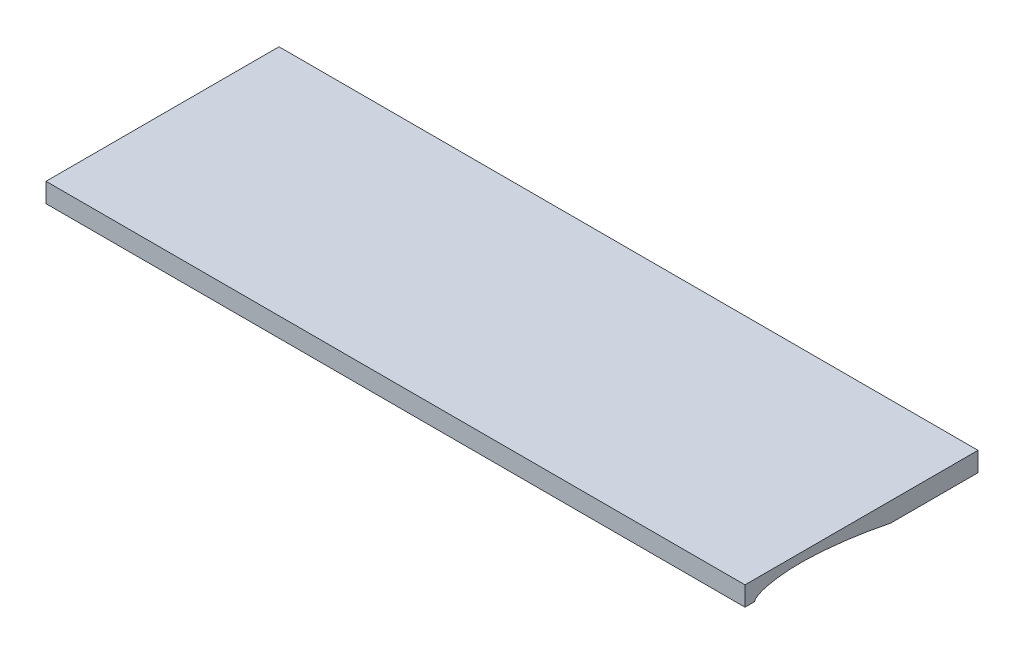
ISO-10303-21;
HEADER;
FILE_DESCRIPTION(('STEP AP214'),'2;1');
FILE_NAME('part.step','',(''),(''),'','','');
FILE_SCHEMA(('AUTOMOTIVE_DESIGN { 1 0 10303 214 1 1 1 1 }'));
ENDSEC;
DATA;
#1=APPLICATION_CONTEXT('core data for automotive mechanical design processes');
#2=APPLICATION_PROTOCOL_DEFINITION('international standard','automotive_design',2000,#1);
#3=PRODUCT_CONTEXT('',#1,'mechanical');
#4=PRODUCT('Part','Part','',(#3));
#5=PRODUCT_RELATED_PRODUCT_CATEGORY('part','',(#4));
#6=PRODUCT_DEFINITION_FORMATION('','',#4);
#7=PRODUCT_DEFINITION_CONTEXT('part definition',#1,'design');
#8=PRODUCT_DEFINITION('design','',#6,#7);
#9=PRODUCT_DEFINITION_SHAPE('','',#8);
#10=(LENGTH_UNIT() NAMED_UNIT(*) SI_UNIT(.MILLI.,.METRE.));
#11=(NAMED_UNIT(*) PLANE_ANGLE_UNIT() SI_UNIT($,.RADIAN.));
#12=(NAMED_UNIT(*) SI_UNIT($,.STERADIAN.) SOLID_ANGLE_UNIT());
#13=UNCERTAINTY_MEASURE_WITH_UNIT(LENGTH_MEASURE(1.E-05),#10,'distance_accuracy_value','');
#14=(GEOMETRIC_REPRESENTATION_CONTEXT(3) GLOBAL_UNCERTAINTY_ASSIGNED_CONTEXT((#13)) GLOBAL_UNIT_ASSIGNED_CONTEXT((#10,
#11,#12)) REPRESENTATION_CONTEXT('',''));
#15=CARTESIAN_POINT('',(0.,0.,0.));
#16=DIRECTION('',(0.,0.,1.));
#17=DIRECTION('',(1.,0.,0.));
#18=AXIS2_PLACEMENT_3D('',#15,#16,#17);
#19=CARTESIAN_POINT('',(0.,0.,0.));
#20=DIRECTION('',(0.,1.,0.));
#21=DIRECTION('',(0.,0.,1.));
#22=AXIS2_PLACEMENT_3D('',#19,#20,#21);
#23=PLANE('',#22);
#24=DIRECTION('',(0.,0.,1.));
#25=VECTOR('',#24,1.);
#26=CARTESIAN_POINT('',(-914.4,0.,0.));
#27=LINE('',#26,#25);
#28=CARTESIAN_POINT('',(-914.4,0.,0.));
#29=VERTEX_POINT('',#28);
#30=CARTESIAN_POINT('',(-914.4,0.,25.4));
#31=VERTEX_POINT('',#30);
#32=EDGE_CURVE('E166',#29,#31,#27,.T.);
#33=ORIENTED_EDGE('',*,*,#32,.F.);
#34=DIRECTION('',(-1.,0.,0.));
#35=VECTOR('',#34,1.);
#36=CARTESIAN_POINT('',(914.4,0.,0.));
#37=LINE('',#36,#35);
#38=CARTESIAN_POINT('',(914.4,0.,0.));
#39=VERTEX_POINT('',#38);
#40=EDGE_CURVE('E51',#29,#39,#37,.F.);
#41=ORIENTED_EDGE('',*,*,#40,.T.);
#42=DIRECTION('',(0.,0.,1.));
#43=VECTOR('',#42,1.);
#44=CARTESIAN_POINT('',(914.4,0.,0.));
#45=LINE('',#44,#43);
#46=CARTESIAN_POINT('',(914.4,0.,25.4));
#47=VERTEX_POINT('',#46);
#48=EDGE_CURVE('E121',#39,#47,#45,.T.);
#49=ORIENTED_EDGE('',*,*,#48,.T.);
#50=DIRECTION('',(1.,0.,0.));
#51=VECTOR('',#50,1.);
#52=CARTESIAN_POINT('',(914.4,0.,25.4));
#53=LINE('',#52,#51);
#54=EDGE_CURVE('E46',#31,#47,#53,.T.);
#55=ORIENTED_EDGE('',*,*,#54,.F.);
#56=EDGE_LOOP('',(#33,#41,#49,#55));
#57=FACE_BOUND('',#56,.T.);
#58=ADVANCED_FACE('F43',(#57),#23,.F.);
#59=CARTESIAN_POINT('',(914.4,0.,-584.2));
#60=VERTEX_POINT('',#59);
#61=CARTESIAN_POINT('',(914.4,0.,-355.6));
#62=VERTEX_POINT('',#61);
#63=EDGE_CURVE('E193',#60,#62,#45,.T.);
#64=ORIENTED_EDGE('',*,*,#63,.T.);
#65=DIRECTION('',(-1.,0.,0.));
#66=VECTOR('',#65,1.);
#67=CARTESIAN_POINT('',(914.4,0.,-355.6));
#68=LINE('',#67,#66);
#69=CARTESIAN_POINT('',(-914.4,0.,-355.6));
#70=VERTEX_POINT('',#69);
#71=EDGE_CURVE('E11',#62,#70,#68,.T.);
#72=ORIENTED_EDGE('',*,*,#71,.T.);
#73=CARTESIAN_POINT('',(-914.4,0.,-584.2));
#74=VERTEX_POINT('',#73);
#75=EDGE_CURVE('E59',#74,#70,#27,.T.);
#76=ORIENTED_EDGE('',*,*,#75,.F.);
#77=DIRECTION('',(-1.,0.,0.));
#78=VECTOR('',#77,1.);
#79=CARTESIAN_POINT('',(914.4,0.,-584.2));
#80=LINE('',#79,#78);
#81=EDGE_CURVE('E191',#60,#74,#80,.T.);
#82=ORIENTED_EDGE('',*,*,#81,.F.);
#83=EDGE_LOOP('',(#64,#72,#76,#82));
#84=FACE_BOUND('',#83,.T.);
#85=ADVANCED_FACE('F141',(#84),#23,.F.);
#86=CARTESIAN_POINT('',(914.4,0.,0.));
#87=DIRECTION('',(1.,0.,0.));
#88=DIRECTION('',(0.,0.,-1.));
#89=AXIS2_PLACEMENT_3D('',#86,#87,#88);
#90=PLANE('',#89);
#91=ORIENTED_EDGE('',*,*,#63,.F.);
#92=DIRECTION('',(0.,1.,0.));
#93=VECTOR('',#92,1.);
#94=CARTESIAN_POINT('',(914.4,50.8,-584.2));
#95=LINE('',#94,#93);
#96=CARTESIAN_POINT('',(914.4,50.8,-584.2));
#97=VERTEX_POINT('',#96);
#98=EDGE_CURVE('E177',#60,#97,#95,.T.);
#99=ORIENTED_EDGE('',*,*,#98,.T.);
#100=DIRECTION('',(0.,0.,1.));
#101=VECTOR('',#100,1.);
#102=CARTESIAN_POINT('',(914.4,50.8,25.4));
#103=LINE('',#102,#101);
#104=CARTESIAN_POINT('',(914.4,50.8,25.4));
#105=VERTEX_POINT('',#104);
#106=EDGE_CURVE('E180',#97,#105,#103,.T.);
#107=ORIENTED_EDGE('',*,*,#106,.T.);
#108=DIRECTION('',(0.,-1.,0.));
#109=VECTOR('',#108,1.);
#110=CARTESIAN_POINT('',(914.4,50.8,25.4));
#111=LINE('',#110,#109);
#112=EDGE_CURVE('E175',#105,#47,#111,.T.);
#113=ORIENTED_EDGE('',*,*,#112,.T.);
#114=ORIENTED_EDGE('',*,*,#48,.F.);
#115=CARTESIAN_POINT('',(914.4,0.0888999932646485,-355.599995778429));
#116=CARTESIAN_POINT('',(914.4,0.484485581174474,-353.719919627978));
#117=CARTESIAN_POINT('',(914.4,1.27499422878835,-349.962916085565));
#118=CARTESIAN_POINT('',(914.4,2.40827403380004,-344.321357203808));
#119=CARTESIAN_POINT('',(914.4,3.51224428554685,-338.683668582805));
#120=CARTESIAN_POINT('',(914.4,4.58778598690869,-333.050236725864));
#121=CARTESIAN_POINT('',(914.4,5.63943265471717,-327.422693692191));
#122=CARTESIAN_POINT('',(914.4,6.66885796095019,-321.802334741478));
#123=CARTESIAN_POINT('',(914.4,8.01138509570149,-314.329135268456));
#124=CARTESIAN_POINT('',(914.4,9.95842272173463,-303.170369870886));
#125=CARTESIAN_POINT('',(914.4,12.1073580768191,-290.19428736061));
#126=CARTESIAN_POINT('',(914.4,14.1187486911346,-277.289771757418));
#127=CARTESIAN_POINT('',(914.4,15.7391510638879,-266.32724231001));
#128=CARTESIAN_POINT('',(914.4,17.7534444628226,-251.907291760423));
#129=CARTESIAN_POINT('',(914.4,19.5782384305861,-237.620805882297));
#130=CARTESIAN_POINT('',(914.4,21.2212030126759,-223.484571154683));
#131=CARTESIAN_POINT('',(914.4,22.3524467404894,-213.079958676204));
#132=CARTESIAN_POINT('',(914.4,23.3907772480329,-202.818953541216));
#133=CARTESIAN_POINT('',(914.4,24.3352201311702,-192.711844060908));
#134=CARTESIAN_POINT('',(914.4,25.1831580524957,-182.768771906038));
#135=CARTESIAN_POINT('',(914.4,25.9306382458563,-172.999706974309));
#136=CARTESIAN_POINT('',(914.4,26.6759749048506,-161.875503699859));
#137=CARTESIAN_POINT('',(914.4,27.3461189359201,-149.491704209398));
#138=CARTESIAN_POINT('',(914.4,27.8403999086836,-135.95080921462));
#139=CARTESIAN_POINT('',(914.4,28.0598914946158,-122.90686374129));
#140=CARTESIAN_POINT('',(914.4,28.000634334178,-110.389557420167));
#141=CARTESIAN_POINT('',(914.4,27.7009853530257,-99.6722079382337));
#142=CARTESIAN_POINT('',(914.4,27.2622927992727,-90.6679719817907));
#143=CARTESIAN_POINT('',(914.4,26.7758575923483,-83.2799929778685));
#144=CARTESIAN_POINT('',(914.4,26.1810853849601,-76.1661794314949));
#145=CARTESIAN_POINT('',(914.4,25.4836516885047,-69.3336988676735));
#146=CARTESIAN_POINT('',(914.4,24.689671340475,-62.7894248802562));
#147=CARTESIAN_POINT('',(914.4,23.8055575461834,-56.5399161880709));
#148=CARTESIAN_POINT('',(914.4,22.8379106465937,-50.5914339032072));
#149=CARTESIAN_POINT('',(914.4,21.7934994750107,-44.9499525321036));
#150=CARTESIAN_POINT('',(914.4,20.6792785482356,-39.6211129124822));
#151=CARTESIAN_POINT('',(914.4,19.6842791067834,-35.3845979102347));
#152=CARTESIAN_POINT('',(914.4,18.666344517664,-31.4108424021032));
#153=CARTESIAN_POINT('',(914.4,17.8281037816429,-28.3940365304039));
#154=CARTESIAN_POINT('',(914.4,16.9507508081887,-25.4941647933605));
#155=CARTESIAN_POINT('',(914.4,16.2934917856738,-23.4386817147605));
#156=CARTESIAN_POINT('',(914.4,15.626915768883,-21.4667801099441));
#157=CARTESIAN_POINT('',(914.4,14.9519127394029,-19.5789527007116));
#158=CARTESIAN_POINT('',(914.4,14.2693659035436,-17.7756646059748));
#159=CARTESIAN_POINT('',(914.4,13.5801227217627,-16.0573627919274));
#160=CARTESIAN_POINT('',(914.4,12.8850105112396,-14.4244662360696));
#161=CARTESIAN_POINT('',(914.4,12.184822001138,-12.8773705758602));
#162=CARTESIAN_POINT('',(914.4,11.4802931460051,-11.4164542302671));
#163=CARTESIAN_POINT('',(914.4,10.7721404320471,-10.042056179485));
#164=CARTESIAN_POINT('',(914.4,10.0609840538432,-8.75451140864337));
#165=CARTESIAN_POINT('',(914.4,9.34742586365131,-7.55410741535457));
#166=CARTESIAN_POINT('',(914.4,8.63197657385887,-6.44111986265641));
#167=CARTESIAN_POINT('',(914.4,7.91507972654084,-5.41579304086776));
#168=CARTESIAN_POINT('',(914.4,7.19710726143535,-4.47834590859567));
#169=CARTESIAN_POINT('',(914.4,6.47834398840472,-3.62897649230648));
#170=CARTESIAN_POINT('',(914.4,5.75899167458045,-2.8678645613673));
#171=CARTESIAN_POINT('',(914.4,5.03915146014301,-2.19519016488507));
#172=CARTESIAN_POINT('',(914.4,4.3188450256708,-1.61113349513031));
#173=CARTESIAN_POINT('',(914.4,3.59800480984628,-1.11592131301051));
#174=CARTESIAN_POINT('',(914.4,2.87650932958446,-0.709825307374234));
#175=CARTESIAN_POINT('',(914.4,2.15423770956035,-0.393271270910302));
#176=CARTESIAN_POINT('',(914.4,1.43114641284214,-0.166504253705502));
#177=CARTESIAN_POINT('',(914.4,0.707331330915151,-0.0307376439622371));
#178=CARTESIAN_POINT('',(914.4,0.00232932620353329,0.0151098098380154));
#179=CARTESIAN_POINT('',(914.4,-0.683215048159153,-0.0301037116403786));
#180=CARTESIAN_POINT('',(914.4,-1.34695958712753,-0.166757282954507));
#181=CARTESIAN_POINT('',(914.4,-2.00572291465681,-0.393300202169732));
#182=CARTESIAN_POINT('',(914.4,-2.65730372587272,-0.709982050953246));
#183=CARTESIAN_POINT('',(914.4,-3.2997623836231,-1.11618132805993));
#184=CARTESIAN_POINT('',(914.4,-3.9313651106067,-1.6115836285801));
#185=CARTESIAN_POINT('',(914.4,-4.55054106118055,-2.1958867596998));
#186=CARTESIAN_POINT('',(914.4,-5.15587344409194,-2.86885359516217));
#187=CARTESIAN_POINT('',(914.4,-5.74607207417029,-3.63028452229133));
#188=CARTESIAN_POINT('',(914.4,-6.31998901706061,-4.47999028296817));
#189=CARTESIAN_POINT('',(914.4,-6.87661798278696,-5.417778420158));
#190=CARTESIAN_POINT('',(914.4,-7.41511817899515,-6.44344047617879));
#191=CARTESIAN_POINT('',(914.4,-7.93480995423522,-7.55674632750534));
#192=CARTESIAN_POINT('',(914.4,-8.43516226683319,-8.75745060156426));
#193=CARTESIAN_POINT('',(914.4,-8.91581846169906,-10.0452727397741));
#194=CARTESIAN_POINT('',(914.4,-9.37654439061302,-11.4199183315632));
#195=CARTESIAN_POINT('',(914.4,-9.81727901053021,-12.8810564986875));
#196=CARTESIAN_POINT('',(914.4,-10.2380485633599,-14.4283426835293));
#197=CARTESIAN_POINT('',(914.4,-10.6390088315133,-16.0614015336329));
#198=CARTESIAN_POINT('',(914.4,-11.0203911753756,-17.7798373710803));
#199=CARTESIAN_POINT('',(914.4,-11.3825035072084,-19.5832301494774));
#200=CARTESIAN_POINT('',(914.4,-11.7256904598538,-21.4711382030198));
#201=CARTESIAN_POINT('',(914.4,-12.050327434657,-23.4430966970589));
#202=CARTESIAN_POINT('',(914.4,-12.3568180216669,-25.4986158577295));
#203=CARTESIAN_POINT('',(914.4,-12.645541453721,-27.6371867964413));
#204=CARTESIAN_POINT('',(914.4,-12.9168636238968,-29.8582780757741));
#205=CARTESIAN_POINT('',(914.4,-13.171121780276,-32.161337168058));
#206=CARTESIAN_POINT('',(914.4,-13.4929712463794,-35.3928718711518));
#207=CARTESIAN_POINT('',(914.4,-13.8511273672977,-39.6335154909436));
#208=CARTESIAN_POINT('',(914.4,-14.2099335232274,-44.9616803141279));
#209=CARTESIAN_POINT('',(914.4,-14.5049014533192,-50.6024317882962));
#210=CARTESIAN_POINT('',(914.4,-14.7360487741375,-56.550155093403));
#211=CARTESIAN_POINT('',(914.4,-14.9032149717867,-62.7988886868957));
#212=CARTESIAN_POINT('',(914.4,-15.0064225630524,-69.342369228511));
#213=CARTESIAN_POINT('',(914.4,-15.0462941548851,-76.1740243212016));
#214=CARTESIAN_POINT('',(914.4,-15.0243336308451,-83.2869671715745));
#215=CARTESIAN_POINT('',(914.4,-14.943132188672,-90.6740259312473));
#216=CARTESIAN_POINT('',(914.4,-14.8063203976315,-98.3277605740099));
#217=CARTESIAN_POINT('',(914.4,-14.618358338504,-106.240488655173));
#218=CARTESIAN_POINT('',(914.4,-14.384158224907,-114.404261408505));
#219=CARTESIAN_POINT('',(914.4,-14.1085883948963,-122.810873498885));
#220=CARTESIAN_POINT('',(914.4,-13.795890052846,-131.451881899253));
#221=CARTESIAN_POINT('',(914.4,-13.4492392711255,-140.31860440387));
#222=CARTESIAN_POINT('',(914.4,-13.070337508655,-149.402126746701));
#223=CARTESIAN_POINT('',(914.4,-12.5165058961395,-161.921237988967));
#224=CARTESIAN_POINT('',(914.4,-11.9011593810326,-174.697664723599));
#225=CARTESIAN_POINT('',(914.4,-11.2171089948709,-187.718132988968));
#226=CARTESIAN_POINT('',(914.4,-10.6596020882973,-197.744296345408));
#227=CARTESIAN_POINT('',(914.4,-10.0623466520962,-207.929345734514));
#228=CARTESIAN_POINT('',(914.4,-9.31920764222235,-220.025511724724));
#229=CARTESIAN_POINT('',(914.4,-8.53057328007864,-232.279253588705));
#230=CARTESIAN_POINT('',(914.4,-7.71271343755829,-244.678709307049));
#231=CARTESIAN_POINT('',(914.4,-6.99693210166396,-255.44982581504));
#232=CARTESIAN_POINT('',(914.4,-6.39751252609224,-264.490823063697));
#233=CARTESIAN_POINT('',(914.4,-5.79620806929575,-273.609082441259));
#234=CARTESIAN_POINT('',(914.4,-5.19363615367616,-282.795452689038));
#235=CARTESIAN_POINT('',(914.4,-4.46750228310593,-293.87201072249));
#236=CARTESIAN_POINT('',(914.4,-3.85089002174569,-303.143053310773));
#237=CARTESIAN_POINT('',(914.4,-3.343108159663,-310.587934230327));
#238=CARTESIAN_POINT('',(914.4,-2.95303735993374,-316.189704639656));
#239=CARTESIAN_POINT('',(914.4,-2.55308304470998,-321.801365045513));
#240=CARTESIAN_POINT('',(914.4,-2.14302939620148,-327.421479554197));
#241=CARTESIAN_POINT('',(914.4,-1.72426808071623,-333.048603174085));
#242=CARTESIAN_POINT('',(914.4,-1.29990899265731,-338.681282887829));
#243=CARTESIAN_POINT('',(914.4,-0.877582286593762,-344.318125247312));
#244=CARTESIAN_POINT('',(914.4,-0.463228732567428,-349.957440029158));
#245=CARTESIAN_POINT('',(914.4,-0.213672512160036,-353.719205679018));
#246=CARTESIAN_POINT('',(914.4,-0.0888999932646483,-355.600004221571));
#247=B_SPLINE_CURVE_WITH_KNOTS('',3,(#115,#116,#117,#118,#119,#120,#121,#122,#123,#124,#125,
#126,#127,#128,#129,#130,#131,#132,#133,#134,#135,#136,#137,#138,#139,#140,#141,#142,#143,#144,
#145,#146,#147,#148,#149,#150,#151,#152,#153,#154,#155,#156,#157,#158,#159,#160,#161,#162,#163,
#164,#165,#166,#167,#168,#169,#170,#171,#172,#173,#174,#175,#176,#177,#178,#179,#180,#181,#182,
#183,#184,#185,#186,#187,#188,#189,#190,#191,#192,#193,#194,#195,#196,#197,#198,#199,#200,#201,
#202,#203,#204,#205,#206,#207,#208,#209,#210,#211,#212,#213,#214,#215,#216,#217,#218,#219,#220,
#221,#222,#223,#224,#225,#226,#227,#228,#229,#230,#231,#232,#233,#234,#235,#236,#237,#238,#239,
#240,#241,#242,#243,#244,#245,#246),.UNSPECIFIED.,.F.,.F.,(4,1,1,1,1,1,1,1,1,1,1,1,1,1,1,1,1,1,
1,1,1,1,1,1,1,1,1,1,1,1,1,1,1,1,1,1,1,1,1,1,1,1,1,1,1,1,1,1,1,1,1,1,1,1,1,1,1,1,1,1,1,1,1,1,1,1,
1,1,1,1,1,1,1,1,1,1,1,1,1,1,1,1,1,1,1,1,1,1,1,1,1,1,1,1,1,1,1,1,1,1,1,1,1,1,1,1,1,1,1,1,1,1,1,1,
1,1,1,1,1,1,1,1,1,1,1,1,1,1,1,4),(0.,0.00794054253800827,0.0158677862260044,0.0237823355295012,
0.0316838418205309,0.0395714657177212,0.0474438053438306,0.0552994066495223,0.0709529074253012,
0.0942599656642179,0.109659748759335,0.124931367508802,0.140060474948947,0.16983616684281,
0.184455938035171,0.198878987847676,0.213091980808253,0.227081363790371,0.24083373334847,
0.254335896346066,0.267574897796778,0.286913018185408,0.305591757157393,0.323574750969682,
0.340828861994365,0.357323531066317,0.367884026456488,0.378086461731641,0.387923234082839,
0.397387015236196,0.406470797189749,0.415167950389097,0.423472243631592,0.431377770088885,
0.438879021724844,0.445971138884747,0.449362330648294,0.455832514431191,0.458910652184174,
0.461883669269834,0.464751272019807,0.467513247226822,0.470169459050699,0.472719871771161,
0.475164566874604,0.477503761569343,0.479737826283505,0.48186733255789,0.483893083712124,
0.485816151684372,0.487637951221375,0.489360302772708,0.490985530021076,0.492516542176065,
0.49395700356015,0.495311466006948,0.496585560552849,0.497786200428971,0.49892178695692,
0.500002352220144,0.501039639811119,0.502046986670077,0.503038994908549,0.503951730837978,
0.504878158030601,0.505831392661311,0.506823575724639,0.507865603008109,0.508967031971782,
0.510136106550442,0.511379884791428,0.512704371017619,0.514114660263003,0.51561509311769,
0.517209348446535,0.518900571097045,0.520691418544469,0.52258414386721,0.524580637882838,
0.526682477749363,0.528890963833217,0.531207133212725,0.533631806027993,0.536165598839476,
0.538808937253662,0.541562081086993,0.544425146730385,0.54739810801092,0.550480817074069,
0.553673026528163,0.556974385201834,0.563902733135108,0.571261380888569,0.579045037483656,
0.587247420068503,0.595861594725327,0.604880098032451,0.614294871054451,0.624097260748233,
0.634278055645911,0.644827521987638,0.655735355300336,0.666990798757914,0.678582536023013,
0.690498842724987,0.702727788654271,0.715257041549763,0.728074047062697,0.75452037740322,
0.768123570697866,0.781962351074077,0.79602290449003,0.810291084820141,0.832050541345135,
0.84677287440772,0.861649926398845,0.876666218949297,0.884221742698137,0.899417940676313,
0.914715475207486,0.930099899620206,0.937820202466263,0.94555696886631,0.953308312238934,
0.961072258877045,0.96884687873477,0.976629764477321,0.984418333857866,0.992209516036237,1.),.UNSPECIFIED.);
#248=CARTESIAN_POINT('',(914.4,0.0888999932646484,-355.599995778429));
#249=VERTEX_POINT('',#248);
#250=EDGE_CURVE('E108',#249,#39,#247,.T.);
#251=ORIENTED_EDGE('',*,*,#250,.F.);
#252=DIRECTION('',(0.,0.999999998872505,4.74867368749079E-05));
#253=VECTOR('',#252,1.);
#254=CARTESIAN_POINT('',(914.4,0.0888999932646484,-355.599995778429));
#255=LINE('',#254,#253);
#256=EDGE_CURVE('E101',#62,#249,#255,.T.);
#257=ORIENTED_EDGE('',*,*,#256,.F.);
#258=EDGE_LOOP('',(#91,#99,#107,#113,#114,#251,#257));
#259=FACE_BOUND('',#258,.T.);
#260=ADVANCED_FACE('F118',(#259),#90,.T.);
#261=CARTESIAN_POINT('',(-914.4,0.,0.));
#262=DIRECTION('',(1.,0.,0.));
#263=DIRECTION('',(0.,0.,-1.));
#264=AXIS2_PLACEMENT_3D('',#261,#262,#263);
#265=PLANE('',#264);
#266=DIRECTION('',(0.,1.,0.));
#267=VECTOR('',#266,1.);
#268=CARTESIAN_POINT('',(-914.4,50.8,-584.2));
#269=LINE('',#268,#267);
#270=CARTESIAN_POINT('',(-914.4,50.8,-584.2));
#271=VERTEX_POINT('',#270);
#272=EDGE_CURVE('E184',#74,#271,#269,.T.);
#273=ORIENTED_EDGE('',*,*,#272,.F.);
#274=ORIENTED_EDGE('',*,*,#75,.T.);
#275=DIRECTION('',(0.,0.999999998872505,4.74867368749079E-05));
#276=VECTOR('',#275,1.);
#277=CARTESIAN_POINT('',(-914.4,0.0888999932646484,-355.599995778429));
#278=LINE('',#277,#276);
#279=CARTESIAN_POINT('',(-914.4,0.0888999932646484,-355.599995778429));
#280=VERTEX_POINT('',#279);
#281=EDGE_CURVE('E123',#70,#280,#278,.T.);
#282=ORIENTED_EDGE('',*,*,#281,.T.);
#283=CARTESIAN_POINT('',(-914.4,0.0888999932646485,-355.599995778429));
#284=CARTESIAN_POINT('',(-914.4,0.484485581174474,-353.719919627978));
#285=CARTESIAN_POINT('',(-914.4,1.27499422878835,-349.962916085565));
#286=CARTESIAN_POINT('',(-914.4,2.40827403380004,-344.321357203808));
#287=CARTESIAN_POINT('',(-914.4,3.51224428554685,-338.683668582805));
#288=CARTESIAN_POINT('',(-914.4,4.58778598690869,-333.050236725864));
#289=CARTESIAN_POINT('',(-914.4,5.63943265471717,-327.422693692191));
#290=CARTESIAN_POINT('',(-914.4,6.66885796095019,-321.802334741478));
#291=CARTESIAN_POINT('',(-914.4,8.01138509570149,-314.329135268456));
#292=CARTESIAN_POINT('',(-914.4,9.95842272173463,-303.170369870886));
#293=CARTESIAN_POINT('',(-914.4,12.1073580768191,-290.19428736061));
#294=CARTESIAN_POINT('',(-914.4,14.1187486911346,-277.289771757418));
#295=CARTESIAN_POINT('',(-914.4,15.7391510638879,-266.32724231001));
#296=CARTESIAN_POINT('',(-914.4,17.7534444628226,-251.907291760423));
#297=CARTESIAN_POINT('',(-914.4,19.5782384305861,-237.620805882297));
#298=CARTESIAN_POINT('',(-914.4,21.2212030126759,-223.484571154683));
#299=CARTESIAN_POINT('',(-914.4,22.3524467404894,-213.079958676204));
#300=CARTESIAN_POINT('',(-914.4,23.3907772480329,-202.818953541216));
#301=CARTESIAN_POINT('',(-914.4,24.3352201311702,-192.711844060908));
#302=CARTESIAN_POINT('',(-914.4,25.1831580524957,-182.768771906038));
#303=CARTESIAN_POINT('',(-914.4,25.9306382458563,-172.999706974309));
#304=CARTESIAN_POINT('',(-914.4,26.6759749048506,-161.875503699859));
#305=CARTESIAN_POINT('',(-914.4,27.3461189359201,-149.491704209398));
#306=CARTESIAN_POINT('',(-914.4,27.8403999086836,-135.95080921462));
#307=CARTESIAN_POINT('',(-914.4,28.0598914946158,-122.90686374129));
#308=CARTESIAN_POINT('',(-914.4,28.000634334178,-110.389557420167));
#309=CARTESIAN_POINT('',(-914.4,27.7009853530257,-99.6722079382337));
#310=CARTESIAN_POINT('',(-914.4,27.2622927992727,-90.6679719817907));
#311=CARTESIAN_POINT('',(-914.4,26.7758575923483,-83.2799929778685));
#312=CARTESIAN_POINT('',(-914.4,26.1810853849601,-76.1661794314949));
#313=CARTESIAN_POINT('',(-914.4,25.4836516885047,-69.3336988676735));
#314=CARTESIAN_POINT('',(-914.4,24.689671340475,-62.7894248802562));
#315=CARTESIAN_POINT('',(-914.4,23.8055575461834,-56.5399161880709));
#316=CARTESIAN_POINT('',(-914.4,22.8379106465937,-50.5914339032072));
#317=CARTESIAN_POINT('',(-914.4,21.7934994750107,-44.9499525321036));
#318=CARTESIAN_POINT('',(-914.4,20.6792785482356,-39.6211129124822));
#319=CARTESIAN_POINT('',(-914.4,19.6842791067834,-35.3845979102347));
#320=CARTESIAN_POINT('',(-914.4,18.666344517664,-31.4108424021032));
#321=CARTESIAN_POINT('',(-914.4,17.8281037816429,-28.3940365304039));
#322=CARTESIAN_POINT('',(-914.4,16.9507508081887,-25.4941647933605));
#323=CARTESIAN_POINT('',(-914.4,16.2934917856738,-23.4386817147605));
#324=CARTESIAN_POINT('',(-914.4,15.626915768883,-21.4667801099441));
#325=CARTESIAN_POINT('',(-914.4,14.9519127394029,-19.5789527007116));
#326=CARTESIAN_POINT('',(-914.4,14.2693659035436,-17.7756646059748));
#327=CARTESIAN_POINT('',(-914.4,13.5801227217627,-16.0573627919274));
#328=CARTESIAN_POINT('',(-914.4,12.8850105112396,-14.4244662360696));
#329=CARTESIAN_POINT('',(-914.4,12.184822001138,-12.8773705758602));
#330=CARTESIAN_POINT('',(-914.4,11.4802931460051,-11.4164542302671));
#331=CARTESIAN_POINT('',(-914.4,10.7721404320471,-10.042056179485));
#332=CARTESIAN_POINT('',(-914.4,10.0609840538432,-8.75451140864337));
#333=CARTESIAN_POINT('',(-914.4,9.34742586365131,-7.55410741535457));
#334=CARTESIAN_POINT('',(-914.4,8.63197657385887,-6.44111986265641));
#335=CARTESIAN_POINT('',(-914.4,7.91507972654084,-5.41579304086776));
#336=CARTESIAN_POINT('',(-914.4,7.19710726143535,-4.47834590859567));
#337=CARTESIAN_POINT('',(-914.4,6.47834398840472,-3.62897649230648));
#338=CARTESIAN_POINT('',(-914.4,5.75899167458045,-2.8678645613673));
#339=CARTESIAN_POINT('',(-914.4,5.03915146014301,-2.19519016488507));
#340=CARTESIAN_POINT('',(-914.4,4.3188450256708,-1.61113349513031));
#341=CARTESIAN_POINT('',(-914.4,3.59800480984628,-1.11592131301051));
#342=CARTESIAN_POINT('',(-914.4,2.87650932958446,-0.709825307374234));
#343=CARTESIAN_POINT('',(-914.4,2.15423770956035,-0.393271270910302));
#344=CARTESIAN_POINT('',(-914.4,1.43114641284214,-0.166504253705502));
#345=CARTESIAN_POINT('',(-914.4,0.707331330915151,-0.0307376439622371));
#346=CARTESIAN_POINT('',(-914.4,0.00232932620353329,0.0151098098380154));
#347=CARTESIAN_POINT('',(-914.4,-0.683215048159153,-0.0301037116403786));
#348=CARTESIAN_POINT('',(-914.4,-1.34695958712753,-0.166757282954507));
#349=CARTESIAN_POINT('',(-914.4,-2.00572291465681,-0.393300202169732));
#350=CARTESIAN_POINT('',(-914.4,-2.65730372587272,-0.709982050953246));
#351=CARTESIAN_POINT('',(-914.4,-3.2997623836231,-1.11618132805993));
#352=CARTESIAN_POINT('',(-914.4,-3.9313651106067,-1.6115836285801));
#353=CARTESIAN_POINT('',(-914.4,-4.55054106118055,-2.1958867596998));
#354=CARTESIAN_POINT('',(-914.4,-5.15587344409194,-2.86885359516217));
#355=CARTESIAN_POINT('',(-914.4,-5.74607207417029,-3.63028452229133));
#356=CARTESIAN_POINT('',(-914.4,-6.31998901706061,-4.47999028296817));
#357=CARTESIAN_POINT('',(-914.4,-6.87661798278696,-5.417778420158));
#358=CARTESIAN_POINT('',(-914.4,-7.41511817899515,-6.44344047617879));
#359=CARTESIAN_POINT('',(-914.4,-7.93480995423522,-7.55674632750534));
#360=CARTESIAN_POINT('',(-914.4,-8.43516226683319,-8.75745060156426));
#361=CARTESIAN_POINT('',(-914.4,-8.91581846169906,-10.0452727397741));
#362=CARTESIAN_POINT('',(-914.4,-9.37654439061302,-11.4199183315632));
#363=CARTESIAN_POINT('',(-914.4,-9.81727901053021,-12.8810564986875));
#364=CARTESIAN_POINT('',(-914.4,-10.2380485633599,-14.4283426835293));
#365=CARTESIAN_POINT('',(-914.4,-10.6390088315133,-16.0614015336329));
#366=CARTESIAN_POINT('',(-914.4,-11.0203911753756,-17.7798373710803));
#367=CARTESIAN_POINT('',(-914.4,-11.3825035072084,-19.5832301494774));
#368=CARTESIAN_POINT('',(-914.4,-11.7256904598538,-21.4711382030198));
#369=CARTESIAN_POINT('',(-914.4,-12.050327434657,-23.4430966970589));
#370=CARTESIAN_POINT('',(-914.4,-12.3568180216669,-25.4986158577295));
#371=CARTESIAN_POINT('',(-914.4,-12.645541453721,-27.6371867964413));
#372=CARTESIAN_POINT('',(-914.4,-12.9168636238968,-29.8582780757741));
#373=CARTESIAN_POINT('',(-914.4,-13.171121780276,-32.161337168058));
#374=CARTESIAN_POINT('',(-914.4,-13.4929712463794,-35.3928718711518));
#375=CARTESIAN_POINT('',(-914.4,-13.8511273672977,-39.6335154909436));
#376=CARTESIAN_POINT('',(-914.4,-14.2099335232274,-44.9616803141279));
#377=CARTESIAN_POINT('',(-914.4,-14.5049014533192,-50.6024317882962));
#378=CARTESIAN_POINT('',(-914.4,-14.7360487741375,-56.550155093403));
#379=CARTESIAN_POINT('',(-914.4,-14.9032149717867,-62.7988886868957));
#380=CARTESIAN_POINT('',(-914.4,-15.0064225630524,-69.342369228511));
#381=CARTESIAN_POINT('',(-914.4,-15.0462941548851,-76.1740243212016));
#382=CARTESIAN_POINT('',(-914.4,-15.0243336308451,-83.2869671715745));
#383=CARTESIAN_POINT('',(-914.4,-14.943132188672,-90.6740259312473));
#384=CARTESIAN_POINT('',(-914.4,-14.8063203976315,-98.3277605740099));
#385=CARTESIAN_POINT('',(-914.4,-14.618358338504,-106.240488655173));
#386=CARTESIAN_POINT('',(-914.4,-14.384158224907,-114.404261408505));
#387=CARTESIAN_POINT('',(-914.4,-14.1085883948963,-122.810873498885));
#388=CARTESIAN_POINT('',(-914.4,-13.795890052846,-131.451881899253));
#389=CARTESIAN_POINT('',(-914.4,-13.4492392711255,-140.31860440387));
#390=CARTESIAN_POINT('',(-914.4,-13.070337508655,-149.402126746701));
#391=CARTESIAN_POINT('',(-914.4,-12.5165058961395,-161.921237988967));
#392=CARTESIAN_POINT('',(-914.4,-11.9011593810326,-174.697664723599));
#393=CARTESIAN_POINT('',(-914.4,-11.2171089948709,-187.718132988968));
#394=CARTESIAN_POINT('',(-914.4,-10.6596020882973,-197.744296345408));
#395=CARTESIAN_POINT('',(-914.4,-10.0623466520962,-207.929345734514));
#396=CARTESIAN_POINT('',(-914.4,-9.31920764222235,-220.025511724724));
#397=CARTESIAN_POINT('',(-914.4,-8.53057328007864,-232.279253588705));
#398=CARTESIAN_POINT('',(-914.4,-7.71271343755829,-244.678709307049));
#399=CARTESIAN_POINT('',(-914.4,-6.99693210166396,-255.44982581504));
#400=CARTESIAN_POINT('',(-914.4,-6.39751252609224,-264.490823063697));
#401=CARTESIAN_POINT('',(-914.4,-5.79620806929575,-273.609082441259));
#402=CARTESIAN_POINT('',(-914.4,-5.19363615367616,-282.795452689038));
#403=CARTESIAN_POINT('',(-914.4,-4.46750228310593,-293.87201072249));
#404=CARTESIAN_POINT('',(-914.4,-3.85089002174569,-303.143053310773));
#405=CARTESIAN_POINT('',(-914.4,-3.343108159663,-310.587934230327));
#406=CARTESIAN_POINT('',(-914.4,-2.95303735993374,-316.189704639656));
#407=CARTESIAN_POINT('',(-914.4,-2.55308304470998,-321.801365045513));
#408=CARTESIAN_POINT('',(-914.4,-2.14302939620148,-327.421479554197));
#409=CARTESIAN_POINT('',(-914.4,-1.72426808071623,-333.048603174085));
#410=CARTESIAN_POINT('',(-914.4,-1.29990899265731,-338.681282887829));
#411=CARTESIAN_POINT('',(-914.4,-0.877582286593762,-344.318125247312));
#412=CARTESIAN_POINT('',(-914.4,-0.463228732567428,-349.957440029158));
#413=CARTESIAN_POINT('',(-914.4,-0.213672512160036,-353.719205679018));
#414=CARTESIAN_POINT('',(-914.4,-0.0888999932646483,-355.600004221571));
#415=B_SPLINE_CURVE_WITH_KNOTS('',3,(#283,#284,#285,#286,#287,#288,#289,#290,#291,#292,#293,
#294,#295,#296,#297,#298,#299,#300,#301,#302,#303,#304,#305,#306,#307,#308,#309,#310,#311,#312,
#313,#314,#315,#316,#317,#318,#319,#320,#321,#322,#323,#324,#325,#326,#327,#328,#329,#330,#331,
#332,#333,#334,#335,#336,#337,#338,#339,#340,#341,#342,#343,#344,#345,#346,#347,#348,#349,#350,
#351,#352,#353,#354,#355,#356,#357,#358,#359,#360,#361,#362,#363,#364,#365,#366,#367,#368,#369,
#370,#371,#372,#373,#374,#375,#376,#377,#378,#379,#380,#381,#382,#383,#384,#385,#386,#387,#388,
#389,#390,#391,#392,#393,#394,#395,#396,#397,#398,#399,#400,#401,#402,#403,#404,#405,#406,#407,
#408,#409,#410,#411,#412,#413,#414),.UNSPECIFIED.,.F.,.F.,(4,1,1,1,1,1,1,1,1,1,1,1,1,1,1,1,1,1,
1,1,1,1,1,1,1,1,1,1,1,1,1,1,1,1,1,1,1,1,1,1,1,1,1,1,1,1,1,1,1,1,1,1,1,1,1,1,1,1,1,1,1,1,1,1,1,1,
1,1,1,1,1,1,1,1,1,1,1,1,1,1,1,1,1,1,1,1,1,1,1,1,1,1,1,1,1,1,1,1,1,1,1,1,1,1,1,1,1,1,1,1,1,1,1,1,
1,1,1,1,1,1,1,1,1,1,1,1,1,1,1,4),(0.,0.00794054253800827,0.0158677862260044,0.0237823355295012,
0.0316838418205309,0.0395714657177212,0.0474438053438306,0.0552994066495223,0.0709529074253012,
0.0942599656642179,0.109659748759335,0.124931367508802,0.140060474948947,0.16983616684281,
0.184455938035171,0.198878987847676,0.213091980808253,0.227081363790371,0.24083373334847,
0.254335896346066,0.267574897796778,0.286913018185408,0.305591757157393,0.323574750969682,
0.340828861994365,0.357323531066317,0.367884026456488,0.378086461731641,0.387923234082839,
0.397387015236196,0.406470797189749,0.415167950389097,0.423472243631592,0.431377770088885,
0.438879021724844,0.445971138884747,0.449362330648294,0.455832514431191,0.458910652184174,
0.461883669269834,0.464751272019807,0.467513247226822,0.470169459050699,0.472719871771161,
0.475164566874604,0.477503761569343,0.479737826283505,0.48186733255789,0.483893083712124,
0.485816151684372,0.487637951221375,0.489360302772708,0.490985530021076,0.492516542176065,
0.49395700356015,0.495311466006948,0.496585560552849,0.497786200428971,0.49892178695692,
0.500002352220144,0.501039639811119,0.502046986670077,0.503038994908549,0.503951730837978,
0.504878158030601,0.505831392661311,0.506823575724639,0.507865603008109,0.508967031971782,
0.510136106550442,0.511379884791428,0.512704371017619,0.514114660263003,0.51561509311769,
0.517209348446535,0.518900571097045,0.520691418544469,0.52258414386721,0.524580637882838,
0.526682477749363,0.528890963833217,0.531207133212725,0.533631806027993,0.536165598839476,
0.538808937253662,0.541562081086993,0.544425146730385,0.54739810801092,0.550480817074069,
0.553673026528163,0.556974385201834,0.563902733135108,0.571261380888569,0.579045037483656,
0.587247420068503,0.595861594725327,0.604880098032451,0.614294871054451,0.624097260748233,
0.634278055645911,0.644827521987638,0.655735355300336,0.666990798757914,0.678582536023013,
0.690498842724987,0.702727788654271,0.715257041549763,0.728074047062697,0.75452037740322,
0.768123570697866,0.781962351074077,0.79602290449003,0.810291084820141,0.832050541345135,
0.84677287440772,0.861649926398845,0.876666218949297,0.884221742698137,0.899417940676313,
0.914715475207486,0.930099899620206,0.937820202466263,0.94555696886631,0.953308312238934,
0.961072258877045,0.96884687873477,0.976629764477321,0.984418333857866,0.992209516036237,1.),.UNSPECIFIED.);
#416=EDGE_CURVE('E115',#280,#29,#415,.T.);
#417=ORIENTED_EDGE('',*,*,#416,.T.);
#418=ORIENTED_EDGE('',*,*,#32,.T.);
#419=DIRECTION('',(0.,-1.,0.));
#420=VECTOR('',#419,1.);
#421=CARTESIAN_POINT('',(-914.4,50.8,25.4));
#422=LINE('',#421,#420);
#423=CARTESIAN_POINT('',(-914.4,50.8,25.4));
#424=VERTEX_POINT('',#423);
#425=EDGE_CURVE('E116',#424,#31,#422,.T.);
#426=ORIENTED_EDGE('',*,*,#425,.F.);
#427=DIRECTION('',(0.,0.,1.));
#428=VECTOR('',#427,1.);
#429=CARTESIAN_POINT('',(-914.4,50.8,25.4));
#430=LINE('',#429,#428);
#431=EDGE_CURVE('E178',#271,#424,#430,.T.);
#432=ORIENTED_EDGE('',*,*,#431,.F.);
#433=EDGE_LOOP('',(#273,#274,#282,#417,#418,#426,#432));
#434=FACE_BOUND('',#433,.T.);
#435=ADVANCED_FACE('F140',(#434),#265,.F.);
#436=CARTESIAN_POINT('',(914.4,50.8,25.4));
#437=DIRECTION('',(0.,0.,-1.));
#438=DIRECTION('',(-1.,0.,0.));
#439=AXIS2_PLACEMENT_3D('',#436,#437,#438);
#440=PLANE('',#439);
#441=ORIENTED_EDGE('',*,*,#425,.T.);
#442=ORIENTED_EDGE('',*,*,#54,.T.);
#443=ORIENTED_EDGE('',*,*,#112,.F.);
#444=DIRECTION('',(-1.,0.,0.));
#445=VECTOR('',#444,1.);
#446=CARTESIAN_POINT('',(914.4,50.8,25.4));
#447=LINE('',#446,#445);
#448=EDGE_CURVE('E182',#105,#424,#447,.T.);
#449=ORIENTED_EDGE('',*,*,#448,.T.);
#450=EDGE_LOOP('',(#441,#442,#443,#449));
#451=FACE_BOUND('',#450,.T.);
#452=ADVANCED_FACE('F144',(#451),#440,.F.);
#453=CARTESIAN_POINT('',(914.4,50.8,-584.2));
#454=DIRECTION('',(0.,0.,1.));
#455=DIRECTION('',(1.,0.,0.));
#456=AXIS2_PLACEMENT_3D('',#453,#454,#455);
#457=PLANE('',#456);
#458=ORIENTED_EDGE('',*,*,#98,.F.);
#459=ORIENTED_EDGE('',*,*,#81,.T.);
#460=ORIENTED_EDGE('',*,*,#272,.T.);
#461=DIRECTION('',(-1.,0.,0.));
#462=VECTOR('',#461,1.);
#463=CARTESIAN_POINT('',(914.4,50.8,-584.2));
#464=LINE('',#463,#462);
#465=EDGE_CURVE('E189',#97,#271,#464,.T.);
#466=ORIENTED_EDGE('',*,*,#465,.F.);
#467=EDGE_LOOP('',(#458,#459,#460,#466));
#468=FACE_BOUND('',#467,.T.);
#469=ADVANCED_FACE('F147',(#468),#457,.F.);
#470=CARTESIAN_POINT('',(914.4,50.8,25.4));
#471=DIRECTION('',(0.,-1.,0.));
#472=DIRECTION('',(0.,0.,-1.));
#473=AXIS2_PLACEMENT_3D('',#470,#471,#472);
#474=PLANE('',#473);
#475=ORIENTED_EDGE('',*,*,#431,.T.);
#476=ORIENTED_EDGE('',*,*,#448,.F.);
#477=ORIENTED_EDGE('',*,*,#106,.F.);
#478=ORIENTED_EDGE('',*,*,#465,.T.);
#479=EDGE_LOOP('',(#475,#476,#477,#478));
#480=FACE_BOUND('',#479,.T.);
#481=ADVANCED_FACE('F137',(#480),#474,.F.);
#482=DIRECTION('',(-1.,0.,0.));
#483=VECTOR('',#482,1.);
#484=SURFACE_OF_LINEAR_EXTRUSION('',#247,#483);
#485=ORIENTED_EDGE('',*,*,#40,.F.);
#486=ORIENTED_EDGE('',*,*,#416,.F.);
#487=DIRECTION('',(-1.,0.,0.));
#488=VECTOR('',#487,1.);
#489=CARTESIAN_POINT('',(914.4,0.0888999932646484,-355.599995778429));
#490=LINE('',#489,#488);
#491=EDGE_CURVE('E104',#249,#280,#490,.T.);
#492=ORIENTED_EDGE('',*,*,#491,.F.);
#493=ORIENTED_EDGE('',*,*,#250,.T.);
#494=EDGE_LOOP('',(#485,#486,#492,#493));
#495=FACE_BOUND('',#494,.T.);
#496=ADVANCED_FACE('F113',(#495),#484,.T.);
#497=CARTESIAN_POINT('',(914.4,0.0888999932646484,-355.599995778429));
#498=DIRECTION('',(0.,-4.74867368749079E-05,0.999999998872505));
#499=DIRECTION('',(0.,-0.999999998872505,-4.74867368749079E-05));
#500=AXIS2_PLACEMENT_3D('',#497,#498,#499);
#501=PLANE('',#500);
#502=ORIENTED_EDGE('',*,*,#71,.F.);
#503=ORIENTED_EDGE('',*,*,#256,.T.);
#504=ORIENTED_EDGE('',*,*,#491,.T.);
#505=ORIENTED_EDGE('',*,*,#281,.F.);
#506=EDGE_LOOP('',(#502,#503,#504,#505));
#507=FACE_BOUND('',#506,.T.);
#508=ADVANCED_FACE('F103',(#507),#501,.T.);
#509=CLOSED_SHELL('',(#58,#85,#260,#435,#452,#469,#481,#496,#508));
#510=MANIFOLD_SOLID_BREP('B2',#509);
#511=ADVANCED_BREP_SHAPE_REPRESENTATION('',(#18,#510),#14);
#512=SHAPE_DEFINITION_REPRESENTATION(#9,#511);
ENDSEC;
END-ISO-10303-21;
